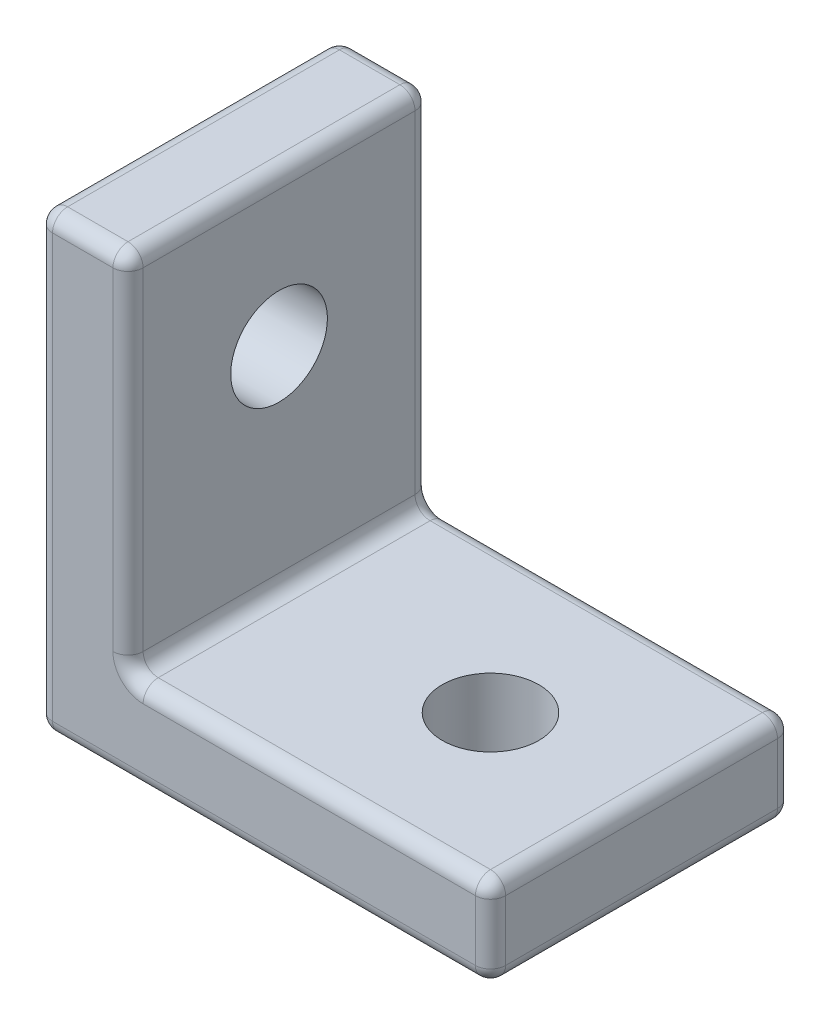
ISO-10303-21;
HEADER;
FILE_DESCRIPTION(('STEP AP214'),'2;1');
FILE_NAME('part.step','',(''),(''),'','','');
FILE_SCHEMA(('AUTOMOTIVE_DESIGN { 1 0 10303 214 1 1 1 1 }'));
ENDSEC;
DATA;
#1=APPLICATION_CONTEXT('core data for automotive mechanical design processes');
#2=APPLICATION_PROTOCOL_DEFINITION('international standard','automotive_design',2000,#1);
#3=PRODUCT_CONTEXT('',#1,'mechanical');
#4=PRODUCT('Part','Part','',(#3));
#5=PRODUCT_RELATED_PRODUCT_CATEGORY('part','',(#4));
#6=PRODUCT_DEFINITION_FORMATION('','',#4);
#7=PRODUCT_DEFINITION_CONTEXT('part definition',#1,'design');
#8=PRODUCT_DEFINITION('design','',#6,#7);
#9=PRODUCT_DEFINITION_SHAPE('','',#8);
#10=(LENGTH_UNIT() NAMED_UNIT(*) SI_UNIT(.MILLI.,.METRE.));
#11=(NAMED_UNIT(*) PLANE_ANGLE_UNIT() SI_UNIT($,.RADIAN.));
#12=(NAMED_UNIT(*) SI_UNIT($,.STERADIAN.) SOLID_ANGLE_UNIT());
#13=UNCERTAINTY_MEASURE_WITH_UNIT(LENGTH_MEASURE(1.E-05),#10,'distance_accuracy_value','');
#14=(GEOMETRIC_REPRESENTATION_CONTEXT(3) GLOBAL_UNCERTAINTY_ASSIGNED_CONTEXT((#13)) GLOBAL_UNIT_ASSIGNED_CONTEXT((#10,
#11,#12)) REPRESENTATION_CONTEXT('',''));
#15=CARTESIAN_POINT('',(0.,0.,0.));
#16=DIRECTION('',(0.,0.,1.));
#17=DIRECTION('',(1.,0.,0.));
#18=AXIS2_PLACEMENT_3D('',#15,#16,#17);
#19=CARTESIAN_POINT('',(3.,15.,10.));
#20=DIRECTION('',(0.,-1.,0.));
#21=DIRECTION('',(0.,0.,-1.));
#22=AXIS2_PLACEMENT_3D('',#19,#20,#21);
#23=PLANE('',#22);
#24=DIRECTION('',(-1.,0.,0.));
#25=VECTOR('',#24,1.);
#26=CARTESIAN_POINT('',(3.,15.,0.5));
#27=LINE('',#26,#25);
#28=CARTESIAN_POINT('',(2.5,15.,0.5));
#29=VERTEX_POINT('',#28);
#30=CARTESIAN_POINT('',(0.499999999999998,15.,0.5));
#31=VERTEX_POINT('',#30);
#32=EDGE_CURVE('E227',#29,#31,#27,.T.);
#33=ORIENTED_EDGE('',*,*,#32,.T.);
#34=DIRECTION('',(0.,0.,-1.));
#35=VECTOR('',#34,1.);
#36=CARTESIAN_POINT('',(0.499999999999998,15.,10.));
#37=LINE('',#36,#35);
#38=CARTESIAN_POINT('',(0.499999999999998,15.,9.5));
#39=VERTEX_POINT('',#38);
#40=EDGE_CURVE('E224',#31,#39,#37,.F.);
#41=ORIENTED_EDGE('',*,*,#40,.T.);
#42=DIRECTION('',(-1.,0.,0.));
#43=VECTOR('',#42,1.);
#44=CARTESIAN_POINT('',(3.,15.,9.5));
#45=LINE('',#44,#43);
#46=CARTESIAN_POINT('',(2.5,15.,9.5));
#47=VERTEX_POINT('',#46);
#48=EDGE_CURVE('E217',#39,#47,#45,.F.);
#49=ORIENTED_EDGE('',*,*,#48,.T.);
#50=DIRECTION('',(0.,0.,-1.));
#51=VECTOR('',#50,1.);
#52=CARTESIAN_POINT('',(2.5,15.,10.));
#53=LINE('',#52,#51);
#54=EDGE_CURVE('E221',#47,#29,#53,.T.);
#55=ORIENTED_EDGE('',*,*,#54,.T.);
#56=EDGE_LOOP('',(#33,#41,#49,#55));
#57=FACE_BOUND('',#56,.T.);
#58=ADVANCED_FACE('F45',(#57),#23,.F.);
#59=CARTESIAN_POINT('',(0.,15.,10.));
#60=DIRECTION('',(1.,0.,0.));
#61=DIRECTION('',(0.,1.,0.));
#62=AXIS2_PLACEMENT_3D('',#59,#60,#61);
#63=PLANE('',#62);
#64=DIRECTION('',(0.,-1.,0.));
#65=VECTOR('',#64,1.);
#66=CARTESIAN_POINT('',(0.,15.,0.5));
#67=LINE('',#66,#65);
#68=CARTESIAN_POINT('',(0.,14.5,0.5));
#69=VERTEX_POINT('',#68);
#70=CARTESIAN_POINT('',(0.,0.5,0.5));
#71=VERTEX_POINT('',#70);
#72=EDGE_CURVE('E296',#69,#71,#67,.T.);
#73=ORIENTED_EDGE('',*,*,#72,.T.);
#74=DIRECTION('',(0.,0.,-1.));
#75=VECTOR('',#74,1.);
#76=CARTESIAN_POINT('',(0.,0.5,10.));
#77=LINE('',#76,#75);
#78=CARTESIAN_POINT('',(0.,0.5,9.5));
#79=VERTEX_POINT('',#78);
#80=EDGE_CURVE('E300',#71,#79,#77,.F.);
#81=ORIENTED_EDGE('',*,*,#80,.T.);
#82=DIRECTION('',(0.,-1.,0.));
#83=VECTOR('',#82,1.);
#84=CARTESIAN_POINT('',(0.,15.,9.5));
#85=LINE('',#84,#83);
#86=CARTESIAN_POINT('',(0.,14.5,9.5));
#87=VERTEX_POINT('',#86);
#88=EDGE_CURVE('E293',#79,#87,#85,.F.);
#89=ORIENTED_EDGE('',*,*,#88,.T.);
#90=DIRECTION('',(0.,0.,-1.));
#91=VECTOR('',#90,1.);
#92=CARTESIAN_POINT('',(0.,14.5,10.));
#93=LINE('',#92,#91);
#94=EDGE_CURVE('E290',#87,#69,#93,.T.);
#95=ORIENTED_EDGE('',*,*,#94,.T.);
#96=EDGE_LOOP('',(#73,#81,#89,#95));
#97=FACE_BOUND('',#96,.T.);
#98=CARTESIAN_POINT('',(0.,10.,5.));
#99=DIRECTION('',(-1.,0.,0.));
#100=DIRECTION('',(0.,-1.,0.));
#101=AXIS2_PLACEMENT_3D('',#98,#99,#100);
#102=CIRCLE('',#101,1.6);
#103=CARTESIAN_POINT('',(0.,8.4,5.));
#104=VERTEX_POINT('',#103);
#105=EDGE_CURVE('E493',#104,#104,#102,.T.);
#106=ORIENTED_EDGE('',*,*,#105,.F.);
#107=EDGE_LOOP('',(#106));
#108=FACE_BOUND('',#107,.T.);
#109=ADVANCED_FACE('F516',(#97,#108),#63,.F.);
#110=CARTESIAN_POINT('',(0.,0.,10.));
#111=DIRECTION('',(0.,1.,0.));
#112=DIRECTION('',(0.,0.,1.));
#113=AXIS2_PLACEMENT_3D('',#110,#111,#112);
#114=PLANE('',#113);
#115=DIRECTION('',(1.,0.,0.));
#116=VECTOR('',#115,1.);
#117=CARTESIAN_POINT('',(0.,0.,0.5));
#118=LINE('',#117,#116);
#119=CARTESIAN_POINT('',(0.5,0.,0.5));
#120=VERTEX_POINT('',#119);
#121=CARTESIAN_POINT('',(14.5,0.,0.5));
#122=VERTEX_POINT('',#121);
#123=EDGE_CURVE('E309',#120,#122,#118,.T.);
#124=ORIENTED_EDGE('',*,*,#123,.T.);
#125=DIRECTION('',(0.,0.,-1.));
#126=VECTOR('',#125,1.);
#127=CARTESIAN_POINT('',(14.5,0.,10.));
#128=LINE('',#127,#126);
#129=CARTESIAN_POINT('',(14.5,0.,9.5));
#130=VERTEX_POINT('',#129);
#131=EDGE_CURVE('E313',#122,#130,#128,.F.);
#132=ORIENTED_EDGE('',*,*,#131,.T.);
#133=DIRECTION('',(1.,0.,0.));
#134=VECTOR('',#133,1.);
#135=CARTESIAN_POINT('',(0.,0.,9.5));
#136=LINE('',#135,#134);
#137=CARTESIAN_POINT('',(0.5,0.,9.5));
#138=VERTEX_POINT('',#137);
#139=EDGE_CURVE('E306',#130,#138,#136,.F.);
#140=ORIENTED_EDGE('',*,*,#139,.T.);
#141=DIRECTION('',(0.,0.,-1.));
#142=VECTOR('',#141,1.);
#143=CARTESIAN_POINT('',(0.5,0.,10.));
#144=LINE('',#143,#142);
#145=EDGE_CURVE('E303',#138,#120,#144,.T.);
#146=ORIENTED_EDGE('',*,*,#145,.T.);
#147=EDGE_LOOP('',(#124,#132,#140,#146));
#148=FACE_BOUND('',#147,.T.);
#149=CARTESIAN_POINT('',(10.,0.,5.));
#150=DIRECTION('',(0.,-1.,0.));
#151=DIRECTION('',(0.,0.,-1.));
#152=AXIS2_PLACEMENT_3D('',#149,#150,#151);
#153=CIRCLE('',#152,1.6);
#154=CARTESIAN_POINT('',(10.,0.,3.4));
#155=VERTEX_POINT('',#154);
#156=EDGE_CURVE('E258',#155,#155,#153,.T.);
#157=ORIENTED_EDGE('',*,*,#156,.F.);
#158=EDGE_LOOP('',(#157));
#159=FACE_BOUND('',#158,.T.);
#160=ADVANCED_FACE('F513',(#148,#159),#114,.F.);
#161=CARTESIAN_POINT('',(15.,0.,10.));
#162=DIRECTION('',(-1.,0.,0.));
#163=DIRECTION('',(0.,0.,1.));
#164=AXIS2_PLACEMENT_3D('',#161,#162,#163);
#165=PLANE('',#164);
#166=DIRECTION('',(0.,1.,0.));
#167=VECTOR('',#166,1.);
#168=CARTESIAN_POINT('',(15.,0.,0.5));
#169=LINE('',#168,#167);
#170=CARTESIAN_POINT('',(15.,0.5,0.5));
#171=VERTEX_POINT('',#170);
#172=CARTESIAN_POINT('',(15.,2.5,0.5));
#173=VERTEX_POINT('',#172);
#174=EDGE_CURVE('E322',#171,#173,#169,.T.);
#175=ORIENTED_EDGE('',*,*,#174,.T.);
#176=DIRECTION('',(0.,0.,-1.));
#177=VECTOR('',#176,1.);
#178=CARTESIAN_POINT('',(15.,2.5,10.));
#179=LINE('',#178,#177);
#180=CARTESIAN_POINT('',(15.,2.5,9.5));
#181=VERTEX_POINT('',#180);
#182=EDGE_CURVE('E326',#173,#181,#179,.F.);
#183=ORIENTED_EDGE('',*,*,#182,.T.);
#184=DIRECTION('',(0.,1.,0.));
#185=VECTOR('',#184,1.);
#186=CARTESIAN_POINT('',(15.,0.,9.5));
#187=LINE('',#186,#185);
#188=CARTESIAN_POINT('',(15.,0.5,9.5));
#189=VERTEX_POINT('',#188);
#190=EDGE_CURVE('E319',#181,#189,#187,.F.);
#191=ORIENTED_EDGE('',*,*,#190,.T.);
#192=DIRECTION('',(0.,0.,-1.));
#193=VECTOR('',#192,1.);
#194=CARTESIAN_POINT('',(15.,0.5,10.));
#195=LINE('',#194,#193);
#196=EDGE_CURVE('E316',#189,#171,#195,.T.);
#197=ORIENTED_EDGE('',*,*,#196,.T.);
#198=EDGE_LOOP('',(#175,#183,#191,#197));
#199=FACE_BOUND('',#198,.T.);
#200=ADVANCED_FACE('F515',(#199),#165,.F.);
#201=CARTESIAN_POINT('',(15.,3.,10.));
#202=DIRECTION('',(0.,-1.,0.));
#203=DIRECTION('',(1.,0.,0.));
#204=AXIS2_PLACEMENT_3D('',#201,#202,#203);
#205=PLANE('',#204);
#206=DIRECTION('',(-1.,0.,0.));
#207=VECTOR('',#206,1.);
#208=CARTESIAN_POINT('',(15.,3.,9.5));
#209=LINE('',#208,#207);
#210=CARTESIAN_POINT('',(3.5,3.,9.5));
#211=VERTEX_POINT('',#210);
#212=CARTESIAN_POINT('',(14.5,3.,9.5));
#213=VERTEX_POINT('',#212);
#214=EDGE_CURVE('E332',#211,#213,#209,.F.);
#215=ORIENTED_EDGE('',*,*,#214,.T.);
#216=DIRECTION('',(0.,0.,-1.));
#217=VECTOR('',#216,1.);
#218=CARTESIAN_POINT('',(14.5,3.,10.));
#219=LINE('',#218,#217);
#220=CARTESIAN_POINT('',(14.5,3.,0.5));
#221=VERTEX_POINT('',#220);
#222=EDGE_CURVE('E339',#213,#221,#219,.T.);
#223=ORIENTED_EDGE('',*,*,#222,.T.);
#224=DIRECTION('',(-1.,0.,0.));
#225=VECTOR('',#224,1.);
#226=CARTESIAN_POINT('',(15.,3.,0.5));
#227=LINE('',#226,#225);
#228=CARTESIAN_POINT('',(3.5,3.,0.5));
#229=VERTEX_POINT('',#228);
#230=EDGE_CURVE('E335',#221,#229,#227,.T.);
#231=ORIENTED_EDGE('',*,*,#230,.T.);
#232=DIRECTION('',(0.,0.,-1.));
#233=VECTOR('',#232,1.);
#234=CARTESIAN_POINT('',(3.5,3.,10.));
#235=LINE('',#234,#233);
#236=EDGE_CURVE('E329',#229,#211,#235,.F.);
#237=ORIENTED_EDGE('',*,*,#236,.T.);
#238=EDGE_LOOP('',(#215,#223,#231,#237));
#239=FACE_BOUND('',#238,.T.);
#240=CARTESIAN_POINT('',(10.,3.,5.));
#241=DIRECTION('',(0.,-1.,0.));
#242=DIRECTION('',(1.,0.,0.));
#243=AXIS2_PLACEMENT_3D('',#240,#241,#242);
#244=CIRCLE('',#243,1.6);
#245=CARTESIAN_POINT('',(11.6,3.,5.));
#246=VERTEX_POINT('',#245);
#247=EDGE_CURVE('E254',#246,#246,#244,.T.);
#248=ORIENTED_EDGE('',*,*,#247,.T.);
#249=EDGE_LOOP('',(#248));
#250=FACE_BOUND('',#249,.T.);
#251=ADVANCED_FACE('F523',(#239,#250),#205,.F.);
#252=CARTESIAN_POINT('',(3.,3.,10.));
#253=DIRECTION('',(-1.,0.,0.));
#254=DIRECTION('',(0.,-1.,0.));
#255=AXIS2_PLACEMENT_3D('',#252,#253,#254);
#256=PLANE('',#255);
#257=DIRECTION('',(0.,1.,0.));
#258=VECTOR('',#257,1.);
#259=CARTESIAN_POINT('',(3.,3.,0.5));
#260=LINE('',#259,#258);
#261=CARTESIAN_POINT('',(3.,3.5,0.5));
#262=VERTEX_POINT('',#261);
#263=CARTESIAN_POINT('',(3.,14.5,0.5));
#264=VERTEX_POINT('',#263);
#265=EDGE_CURVE('E348',#262,#264,#260,.T.);
#266=ORIENTED_EDGE('',*,*,#265,.T.);
#267=DIRECTION('',(0.,0.,-1.));
#268=VECTOR('',#267,1.);
#269=CARTESIAN_POINT('',(3.,14.5,10.));
#270=LINE('',#269,#268);
#271=CARTESIAN_POINT('',(3.,14.5,9.5));
#272=VERTEX_POINT('',#271);
#273=EDGE_CURVE('E352',#264,#272,#270,.F.);
#274=ORIENTED_EDGE('',*,*,#273,.T.);
#275=DIRECTION('',(0.,1.,0.));
#276=VECTOR('',#275,1.);
#277=CARTESIAN_POINT('',(3.,3.,9.5));
#278=LINE('',#277,#276);
#279=CARTESIAN_POINT('',(3.,3.5,9.5));
#280=VERTEX_POINT('',#279);
#281=EDGE_CURVE('E345',#272,#280,#278,.F.);
#282=ORIENTED_EDGE('',*,*,#281,.T.);
#283=DIRECTION('',(0.,0.,-1.));
#284=VECTOR('',#283,1.);
#285=CARTESIAN_POINT('',(3.,3.5,0.));
#286=LINE('',#285,#284);
#287=EDGE_CURVE('E342',#280,#262,#286,.T.);
#288=ORIENTED_EDGE('',*,*,#287,.T.);
#289=EDGE_LOOP('',(#266,#274,#282,#288));
#290=FACE_BOUND('',#289,.T.);
#291=CARTESIAN_POINT('',(3.,10.,5.));
#292=DIRECTION('',(-1.,0.,0.));
#293=DIRECTION('',(0.,-1.,0.));
#294=AXIS2_PLACEMENT_3D('',#291,#292,#293);
#295=CIRCLE('',#294,1.6);
#296=CARTESIAN_POINT('',(3.,8.4,5.));
#297=VERTEX_POINT('',#296);
#298=EDGE_CURVE('E261',#297,#297,#295,.T.);
#299=ORIENTED_EDGE('',*,*,#298,.T.);
#300=EDGE_LOOP('',(#299));
#301=FACE_BOUND('',#300,.T.);
#302=ADVANCED_FACE('F665',(#290,#301),#256,.F.);
#303=CARTESIAN_POINT('',(0.,0.,10.));
#304=DIRECTION('',(0.,0.,1.));
#305=DIRECTION('',(1.,0.,0.));
#306=AXIS2_PLACEMENT_3D('',#303,#304,#305);
#307=PLANE('',#306);
#308=DIRECTION('',(0.,1.,0.));
#309=VECTOR('',#308,1.);
#310=CARTESIAN_POINT('',(2.5,15.,10.));
#311=LINE('',#310,#309);
#312=CARTESIAN_POINT('',(2.5,3.5,10.));
#313=VERTEX_POINT('',#312);
#314=CARTESIAN_POINT('',(2.5,14.5,10.));
#315=VERTEX_POINT('',#314);
#316=EDGE_CURVE('E355',#313,#315,#311,.T.);
#317=ORIENTED_EDGE('',*,*,#316,.T.);
#318=DIRECTION('',(-1.,0.,0.));
#319=VECTOR('',#318,1.);
#320=CARTESIAN_POINT('',(0.,14.5,10.));
#321=LINE('',#320,#319);
#322=CARTESIAN_POINT('',(0.499999999999998,14.5,10.));
#323=VERTEX_POINT('',#322);
#324=EDGE_CURVE('E11',#315,#323,#321,.T.);
#325=ORIENTED_EDGE('',*,*,#324,.T.);
#326=DIRECTION('',(0.,-1.,0.));
#327=VECTOR('',#326,1.);
#328=CARTESIAN_POINT('',(0.5,0.,10.));
#329=LINE('',#328,#327);
#330=CARTESIAN_POINT('',(0.5,0.5,10.));
#331=VERTEX_POINT('',#330);
#332=EDGE_CURVE('E55',#323,#331,#329,.T.);
#333=ORIENTED_EDGE('',*,*,#332,.T.);
#334=DIRECTION('',(1.,0.,0.));
#335=VECTOR('',#334,1.);
#336=CARTESIAN_POINT('',(15.,0.5,10.));
#337=LINE('',#336,#335);
#338=CARTESIAN_POINT('',(14.5,0.5,10.));
#339=VERTEX_POINT('',#338);
#340=EDGE_CURVE('E368',#331,#339,#337,.T.);
#341=ORIENTED_EDGE('',*,*,#340,.T.);
#342=DIRECTION('',(0.,1.,0.));
#343=VECTOR('',#342,1.);
#344=CARTESIAN_POINT('',(14.5,3.,10.));
#345=LINE('',#344,#343);
#346=CARTESIAN_POINT('',(14.5,2.5,10.));
#347=VERTEX_POINT('',#346);
#348=EDGE_CURVE('E365',#339,#347,#345,.T.);
#349=ORIENTED_EDGE('',*,*,#348,.T.);
#350=DIRECTION('',(-1.,0.,0.));
#351=VECTOR('',#350,1.);
#352=CARTESIAN_POINT('',(3.,2.5,10.));
#353=LINE('',#352,#351);
#354=CARTESIAN_POINT('',(3.5,2.5,10.));
#355=VERTEX_POINT('',#354);
#356=EDGE_CURVE('E362',#347,#355,#353,.T.);
#357=ORIENTED_EDGE('',*,*,#356,.T.);
#358=CARTESIAN_POINT('',(3.5,3.5,10.));
#359=DIRECTION('',(0.,0.,1.));
#360=DIRECTION('',(1.,0.,0.));
#361=AXIS2_PLACEMENT_3D('',#358,#359,#360);
#362=CIRCLE('',#361,1.);
#363=EDGE_CURVE('E358',#313,#355,#362,.T.);
#364=ORIENTED_EDGE('',*,*,#363,.F.);
#365=EDGE_LOOP('',(#317,#325,#333,#341,#349,#357,#364));
#366=FACE_BOUND('',#365,.T.);
#367=ADVANCED_FACE('F647',(#366),#307,.T.);
#368=CARTESIAN_POINT('',(0.,0.,0.));
#369=DIRECTION('',(0.,0.,1.));
#370=DIRECTION('',(1.,0.,0.));
#371=AXIS2_PLACEMENT_3D('',#368,#369,#370);
#372=PLANE('',#371);
#373=DIRECTION('',(0.,-1.,0.));
#374=VECTOR('',#373,1.);
#375=CARTESIAN_POINT('',(0.5,0.,0.));
#376=LINE('',#375,#374);
#377=CARTESIAN_POINT('',(0.5,0.5,0.));
#378=VERTEX_POINT('',#377);
#379=CARTESIAN_POINT('',(0.499999999999998,14.5,0.));
#380=VERTEX_POINT('',#379);
#381=EDGE_CURVE('E283',#378,#380,#376,.F.);
#382=ORIENTED_EDGE('',*,*,#381,.T.);
#383=DIRECTION('',(-1.,0.,0.));
#384=VECTOR('',#383,1.);
#385=CARTESIAN_POINT('',(0.,14.5,0.));
#386=LINE('',#385,#384);
#387=CARTESIAN_POINT('',(2.5,14.5,0.));
#388=VERTEX_POINT('',#387);
#389=EDGE_CURVE('E286',#380,#388,#386,.F.);
#390=ORIENTED_EDGE('',*,*,#389,.T.);
#391=DIRECTION('',(0.,1.,0.));
#392=VECTOR('',#391,1.);
#393=CARTESIAN_POINT('',(2.5,0.,0.));
#394=LINE('',#393,#392);
#395=CARTESIAN_POINT('',(2.5,3.5,0.));
#396=VERTEX_POINT('',#395);
#397=EDGE_CURVE('E271',#388,#396,#394,.F.);
#398=ORIENTED_EDGE('',*,*,#397,.T.);
#399=CARTESIAN_POINT('',(3.5,3.5,0.));
#400=DIRECTION('',(0.,0.,1.));
#401=DIRECTION('',(1.,0.,0.));
#402=AXIS2_PLACEMENT_3D('',#399,#400,#401);
#403=CIRCLE('',#402,1.);
#404=CARTESIAN_POINT('',(3.5,2.5,0.));
#405=VERTEX_POINT('',#404);
#406=EDGE_CURVE('E267',#405,#396,#403,.F.);
#407=ORIENTED_EDGE('',*,*,#406,.F.);
#408=DIRECTION('',(-1.,0.,0.));
#409=VECTOR('',#408,1.);
#410=CARTESIAN_POINT('',(0.,2.5,0.));
#411=LINE('',#410,#409);
#412=CARTESIAN_POINT('',(14.5,2.5,0.));
#413=VERTEX_POINT('',#412);
#414=EDGE_CURVE('E274',#405,#413,#411,.F.);
#415=ORIENTED_EDGE('',*,*,#414,.T.);
#416=DIRECTION('',(0.,1.,0.));
#417=VECTOR('',#416,1.);
#418=CARTESIAN_POINT('',(14.5,0.,0.));
#419=LINE('',#418,#417);
#420=CARTESIAN_POINT('',(14.5,0.5,0.));
#421=VERTEX_POINT('',#420);
#422=EDGE_CURVE('E277',#413,#421,#419,.F.);
#423=ORIENTED_EDGE('',*,*,#422,.T.);
#424=DIRECTION('',(1.,0.,0.));
#425=VECTOR('',#424,1.);
#426=CARTESIAN_POINT('',(0.,0.5,0.));
#427=LINE('',#426,#425);
#428=EDGE_CURVE('E280',#421,#378,#427,.F.);
#429=ORIENTED_EDGE('',*,*,#428,.T.);
#430=EDGE_LOOP('',(#382,#390,#398,#407,#415,#423,#429));
#431=FACE_BOUND('',#430,.T.);
#432=ADVANCED_FACE('F694',(#431),#372,.F.);
#433=CARTESIAN_POINT('',(10.,5.,5.));
#434=DIRECTION('',(0.,-1.,0.));
#435=DIRECTION('',(0.,0.,-1.));
#436=AXIS2_PLACEMENT_3D('',#433,#434,#435);
#437=CYLINDRICAL_SURFACE('',#436,1.6);
#438=ORIENTED_EDGE('',*,*,#156,.T.);
#439=EDGE_LOOP('',(#438));
#440=FACE_BOUND('',#439,.T.);
#441=ORIENTED_EDGE('',*,*,#247,.F.);
#442=EDGE_LOOP('',(#441));
#443=FACE_BOUND('',#442,.T.);
#444=ADVANCED_FACE('F510',(#440,#443),#437,.F.);
#445=CARTESIAN_POINT('',(5.,10.,5.));
#446=DIRECTION('',(-1.,0.,0.));
#447=DIRECTION('',(0.,-1.,0.));
#448=AXIS2_PLACEMENT_3D('',#445,#446,#447);
#449=CYLINDRICAL_SURFACE('',#448,1.6);
#450=ORIENTED_EDGE('',*,*,#105,.T.);
#451=EDGE_LOOP('',(#450));
#452=FACE_BOUND('',#451,.T.);
#453=ORIENTED_EDGE('',*,*,#298,.F.);
#454=EDGE_LOOP('',(#453));
#455=FACE_BOUND('',#454,.T.);
#456=ADVANCED_FACE('F641',(#452,#455),#449,.F.);
#457=CARTESIAN_POINT('',(14.5,0.,9.5));
#458=DIRECTION('',(0.,-1.,0.));
#459=DIRECTION('',(0.,0.,-1.));
#460=AXIS2_PLACEMENT_3D('',#457,#458,#459);
#461=CYLINDRICAL_SURFACE('',#460,0.5);
#462=CARTESIAN_POINT('',(14.5,2.5,9.5));
#463=DIRECTION('',(0.,1.,0.));
#464=DIRECTION('',(0.,0.,1.));
#465=AXIS2_PLACEMENT_3D('',#462,#463,#464);
#466=CIRCLE('',#465,0.5);
#467=EDGE_CURVE('E49',#347,#181,#466,.T.);
#468=ORIENTED_EDGE('',*,*,#467,.F.);
#469=ORIENTED_EDGE('',*,*,#348,.F.);
#470=CARTESIAN_POINT('',(14.5,0.5,9.5));
#471=DIRECTION('',(0.,-1.,0.));
#472=DIRECTION('',(0.,0.,-1.));
#473=AXIS2_PLACEMENT_3D('',#470,#471,#472);
#474=CIRCLE('',#473,0.5);
#475=EDGE_CURVE('E484',#189,#339,#474,.T.);
#476=ORIENTED_EDGE('',*,*,#475,.F.);
#477=ORIENTED_EDGE('',*,*,#190,.F.);
#478=EDGE_LOOP('',(#468,#469,#476,#477));
#479=FACE_BOUND('',#478,.T.);
#480=ADVANCED_FACE('F47',(#479),#461,.T.);
#481=CARTESIAN_POINT('',(14.5,2.5,9.5));
#482=DIRECTION('',(1.,0.,0.));
#483=DIRECTION('',(0.,0.,-1.));
#484=AXIS2_PLACEMENT_3D('',#481,#482,#483);
#485=SPHERICAL_SURFACE('',#484,0.5);
#486=CARTESIAN_POINT('',(14.5,2.5,9.5));
#487=DIRECTION('',(1.,0.,0.));
#488=DIRECTION('',(0.,0.,-1.));
#489=AXIS2_PLACEMENT_3D('',#486,#487,#488);
#490=CIRCLE('',#489,0.5);
#491=EDGE_CURVE('E477',#347,#213,#490,.F.);
#492=ORIENTED_EDGE('',*,*,#491,.F.);
#493=ORIENTED_EDGE('',*,*,#467,.T.);
#494=CARTESIAN_POINT('',(14.5,2.5,9.5));
#495=DIRECTION('',(0.,0.,1.));
#496=DIRECTION('',(1.,0.,0.));
#497=AXIS2_PLACEMENT_3D('',#494,#495,#496);
#498=CIRCLE('',#497,0.5);
#499=EDGE_CURVE('E481',#213,#181,#498,.F.);
#500=ORIENTED_EDGE('',*,*,#499,.F.);
#501=EDGE_LOOP('',(#492,#493,#500));
#502=FACE_BOUND('',#501,.T.);
#503=ADVANCED_FACE('F636',(#502),#485,.T.);
#504=CARTESIAN_POINT('',(14.5,0.5,9.5));
#505=DIRECTION('',(0.,0.,1.));
#506=DIRECTION('',(1.,0.,0.));
#507=AXIS2_PLACEMENT_3D('',#504,#505,#506);
#508=SPHERICAL_SURFACE('',#507,0.5);
#509=CARTESIAN_POINT('',(14.5,0.5,9.5));
#510=DIRECTION('',(0.,0.,1.));
#511=DIRECTION('',(1.,0.,0.));
#512=AXIS2_PLACEMENT_3D('',#509,#510,#511);
#513=CIRCLE('',#512,0.5);
#514=EDGE_CURVE('E469',#189,#130,#513,.F.);
#515=ORIENTED_EDGE('',*,*,#514,.F.);
#516=ORIENTED_EDGE('',*,*,#475,.T.);
#517=CARTESIAN_POINT('',(14.5,0.5,9.5));
#518=DIRECTION('',(1.,0.,0.));
#519=DIRECTION('',(0.,0.,-1.));
#520=AXIS2_PLACEMENT_3D('',#517,#518,#519);
#521=CIRCLE('',#520,0.5);
#522=EDGE_CURVE('E473',#130,#339,#521,.F.);
#523=ORIENTED_EDGE('',*,*,#522,.F.);
#524=EDGE_LOOP('',(#515,#516,#523));
#525=FACE_BOUND('',#524,.T.);
#526=ADVANCED_FACE('F633',(#525),#508,.T.);
#527=CARTESIAN_POINT('',(14.5,2.5,10.));
#528=DIRECTION('',(0.,0.,-1.));
#529=DIRECTION('',(-1.,0.,0.));
#530=AXIS2_PLACEMENT_3D('',#527,#528,#529);
#531=CYLINDRICAL_SURFACE('',#530,0.5);
#532=ORIENTED_EDGE('',*,*,#499,.T.);
#533=ORIENTED_EDGE('',*,*,#182,.F.);
#534=CARTESIAN_POINT('',(14.5,2.5,0.5));
#535=DIRECTION('',(0.,0.,-1.));
#536=DIRECTION('',(-1.,0.,0.));
#537=AXIS2_PLACEMENT_3D('',#534,#535,#536);
#538=CIRCLE('',#537,0.5);
#539=EDGE_CURVE('E462',#221,#173,#538,.T.);
#540=ORIENTED_EDGE('',*,*,#539,.F.);
#541=ORIENTED_EDGE('',*,*,#222,.F.);
#542=EDGE_LOOP('',(#532,#533,#540,#541));
#543=FACE_BOUND('',#542,.T.);
#544=ADVANCED_FACE('F629',(#543),#531,.T.);
#545=CARTESIAN_POINT('',(0.,2.5,9.5));
#546=DIRECTION('',(1.,0.,0.));
#547=DIRECTION('',(0.,1.,0.));
#548=AXIS2_PLACEMENT_3D('',#545,#546,#547);
#549=CYLINDRICAL_SURFACE('',#548,0.5);
#550=ORIENTED_EDGE('',*,*,#491,.T.);
#551=ORIENTED_EDGE('',*,*,#214,.F.);
#552=CARTESIAN_POINT('',(3.5,2.5,9.5));
#553=DIRECTION('',(-1.,0.,0.));
#554=DIRECTION('',(0.,0.,1.));
#555=AXIS2_PLACEMENT_3D('',#552,#553,#554);
#556=CIRCLE('',#555,0.5);
#557=EDGE_CURVE('E458',#355,#211,#556,.T.);
#558=ORIENTED_EDGE('',*,*,#557,.F.);
#559=ORIENTED_EDGE('',*,*,#356,.F.);
#560=EDGE_LOOP('',(#550,#551,#558,#559));
#561=FACE_BOUND('',#560,.T.);
#562=ADVANCED_FACE('F625',(#561),#549,.T.);
#563=CARTESIAN_POINT('',(0.,0.5,9.5));
#564=DIRECTION('',(-1.,0.,0.));
#565=DIRECTION('',(0.,0.,1.));
#566=AXIS2_PLACEMENT_3D('',#563,#564,#565);
#567=CYLINDRICAL_SURFACE('',#566,0.5);
#568=ORIENTED_EDGE('',*,*,#522,.T.);
#569=ORIENTED_EDGE('',*,*,#340,.F.);
#570=CARTESIAN_POINT('',(0.5,0.5,9.5));
#571=DIRECTION('',(-1.,0.,0.));
#572=DIRECTION('',(0.,0.,1.));
#573=AXIS2_PLACEMENT_3D('',#570,#571,#572);
#574=CIRCLE('',#573,0.5);
#575=EDGE_CURVE('E454',#138,#331,#574,.T.);
#576=ORIENTED_EDGE('',*,*,#575,.F.);
#577=ORIENTED_EDGE('',*,*,#139,.F.);
#578=EDGE_LOOP('',(#568,#569,#576,#577));
#579=FACE_BOUND('',#578,.T.);
#580=ADVANCED_FACE('F621',(#579),#567,.T.);
#581=CARTESIAN_POINT('',(14.5,0.5,10.));
#582=DIRECTION('',(0.,0.,-1.));
#583=DIRECTION('',(-1.,0.,0.));
#584=AXIS2_PLACEMENT_3D('',#581,#582,#583);
#585=CYLINDRICAL_SURFACE('',#584,0.5);
#586=ORIENTED_EDGE('',*,*,#514,.T.);
#587=ORIENTED_EDGE('',*,*,#131,.F.);
#588=CARTESIAN_POINT('',(14.5,0.5,0.5));
#589=DIRECTION('',(0.,0.,-1.));
#590=DIRECTION('',(-1.,0.,0.));
#591=AXIS2_PLACEMENT_3D('',#588,#589,#590);
#592=CIRCLE('',#591,0.5);
#593=EDGE_CURVE('E450',#171,#122,#592,.T.);
#594=ORIENTED_EDGE('',*,*,#593,.F.);
#595=ORIENTED_EDGE('',*,*,#196,.F.);
#596=EDGE_LOOP('',(#586,#587,#594,#595));
#597=FACE_BOUND('',#596,.T.);
#598=ADVANCED_FACE('F617',(#597),#585,.T.);
#599=CARTESIAN_POINT('',(14.5,0.,0.5));
#600=DIRECTION('',(0.,1.,0.));
#601=DIRECTION('',(0.,0.,1.));
#602=AXIS2_PLACEMENT_3D('',#599,#600,#601);
#603=CYLINDRICAL_SURFACE('',#602,0.5);
#604=CARTESIAN_POINT('',(14.5,2.5,0.5));
#605=DIRECTION('',(0.,1.,0.));
#606=DIRECTION('',(0.,0.,1.));
#607=AXIS2_PLACEMENT_3D('',#604,#605,#606);
#608=CIRCLE('',#607,0.5);
#609=EDGE_CURVE('E465',#173,#413,#608,.T.);
#610=ORIENTED_EDGE('',*,*,#609,.F.);
#611=ORIENTED_EDGE('',*,*,#174,.F.);
#612=CARTESIAN_POINT('',(14.5,0.5,0.5));
#613=DIRECTION('',(0.,-1.,0.));
#614=DIRECTION('',(0.,0.,-1.));
#615=AXIS2_PLACEMENT_3D('',#612,#613,#614);
#616=CIRCLE('',#615,0.5);
#617=EDGE_CURVE('E446',#421,#171,#616,.T.);
#618=ORIENTED_EDGE('',*,*,#617,.F.);
#619=ORIENTED_EDGE('',*,*,#422,.F.);
#620=EDGE_LOOP('',(#610,#611,#618,#619));
#621=FACE_BOUND('',#620,.T.);
#622=ADVANCED_FACE('F613',(#621),#603,.T.);
#623=CARTESIAN_POINT('',(14.5,2.5,0.5));
#624=DIRECTION('',(1.,0.,0.));
#625=DIRECTION('',(0.,0.,-1.));
#626=AXIS2_PLACEMENT_3D('',#623,#624,#625);
#627=SPHERICAL_SURFACE('',#626,0.5);
#628=ORIENTED_EDGE('',*,*,#539,.T.);
#629=ORIENTED_EDGE('',*,*,#609,.T.);
#630=CARTESIAN_POINT('',(14.5,2.5,0.5));
#631=DIRECTION('',(1.,0.,0.));
#632=DIRECTION('',(0.,0.,-1.));
#633=AXIS2_PLACEMENT_3D('',#630,#631,#632);
#634=CIRCLE('',#633,0.5);
#635=EDGE_CURVE('E442',#221,#413,#634,.F.);
#636=ORIENTED_EDGE('',*,*,#635,.F.);
#637=EDGE_LOOP('',(#628,#629,#636));
#638=FACE_BOUND('',#637,.T.);
#639=ADVANCED_FACE('F609',(#638),#627,.T.);
#640=CARTESIAN_POINT('',(3.5,3.5,9.5));
#641=DIRECTION('',(0.,0.,1.));
#642=DIRECTION('',(1.,0.,0.));
#643=AXIS2_PLACEMENT_3D('',#640,#641,#642);
#644=TOROIDAL_SURFACE('',#643,1.,0.5);
#645=ORIENTED_EDGE('',*,*,#363,.T.);
#646=ORIENTED_EDGE('',*,*,#557,.T.);
#647=CARTESIAN_POINT('',(3.5,3.5,9.5));
#648=DIRECTION('',(0.,0.,1.));
#649=DIRECTION('',(1.,0.,0.));
#650=AXIS2_PLACEMENT_3D('',#647,#648,#649);
#651=CIRCLE('',#650,0.5);
#652=EDGE_CURVE('E438',#280,#211,#651,.T.);
#653=ORIENTED_EDGE('',*,*,#652,.F.);
#654=CARTESIAN_POINT('',(2.5,3.5,9.5));
#655=DIRECTION('',(0.,-1.,0.));
#656=DIRECTION('',(0.,0.,-1.));
#657=AXIS2_PLACEMENT_3D('',#654,#655,#656);
#658=CIRCLE('',#657,0.5);
#659=EDGE_CURVE('E434',#313,#280,#658,.F.);
#660=ORIENTED_EDGE('',*,*,#659,.F.);
#661=EDGE_LOOP('',(#645,#646,#653,#660));
#662=FACE_BOUND('',#661,.T.);
#663=ADVANCED_FACE('F605',(#662),#644,.T.);
#664=CARTESIAN_POINT('',(0.5,0.5,9.5));
#665=DIRECTION('',(0.,0.,1.));
#666=DIRECTION('',(1.,0.,0.));
#667=AXIS2_PLACEMENT_3D('',#664,#665,#666);
#668=SPHERICAL_SURFACE('',#667,0.5);
#669=CARTESIAN_POINT('',(0.5,0.5,9.5));
#670=DIRECTION('',(0.,0.,1.));
#671=DIRECTION('',(1.,0.,0.));
#672=AXIS2_PLACEMENT_3D('',#669,#670,#671);
#673=CIRCLE('',#672,0.5);
#674=EDGE_CURVE('E426',#138,#79,#673,.F.);
#675=ORIENTED_EDGE('',*,*,#674,.F.);
#676=ORIENTED_EDGE('',*,*,#575,.T.);
#677=CARTESIAN_POINT('',(0.5,0.5,9.5));
#678=DIRECTION('',(0.,-1.,0.));
#679=DIRECTION('',(1.,0.,0.));
#680=AXIS2_PLACEMENT_3D('',#677,#678,#679);
#681=CIRCLE('',#680,0.5);
#682=EDGE_CURVE('E430',#79,#331,#681,.F.);
#683=ORIENTED_EDGE('',*,*,#682,.F.);
#684=EDGE_LOOP('',(#675,#676,#683));
#685=FACE_BOUND('',#684,.T.);
#686=ADVANCED_FACE('F601',(#685),#668,.T.);
#687=CARTESIAN_POINT('',(14.5,0.5,0.5));
#688=DIRECTION('',(1.,0.,0.));
#689=DIRECTION('',(0.,0.,-1.));
#690=AXIS2_PLACEMENT_3D('',#687,#688,#689);
#691=SPHERICAL_SURFACE('',#690,0.5);
#692=ORIENTED_EDGE('',*,*,#617,.T.);
#693=ORIENTED_EDGE('',*,*,#593,.T.);
#694=CARTESIAN_POINT('',(14.5,0.5,0.5));
#695=DIRECTION('',(1.,0.,0.));
#696=DIRECTION('',(0.,0.,-1.));
#697=AXIS2_PLACEMENT_3D('',#694,#695,#696);
#698=CIRCLE('',#697,0.5);
#699=EDGE_CURVE('E423',#421,#122,#698,.F.);
#700=ORIENTED_EDGE('',*,*,#699,.F.);
#701=EDGE_LOOP('',(#692,#693,#700));
#702=FACE_BOUND('',#701,.T.);
#703=ADVANCED_FACE('F597',(#702),#691,.T.);
#704=CARTESIAN_POINT('',(15.,2.5,0.5));
#705=DIRECTION('',(-1.,0.,0.));
#706=DIRECTION('',(0.,-1.,0.));
#707=AXIS2_PLACEMENT_3D('',#704,#705,#706);
#708=CYLINDRICAL_SURFACE('',#707,0.5);
#709=ORIENTED_EDGE('',*,*,#635,.T.);
#710=ORIENTED_EDGE('',*,*,#414,.F.);
#711=CARTESIAN_POINT('',(3.5,2.5,0.5));
#712=DIRECTION('',(-1.,0.,0.));
#713=DIRECTION('',(0.,0.,1.));
#714=AXIS2_PLACEMENT_3D('',#711,#712,#713);
#715=CIRCLE('',#714,0.5);
#716=EDGE_CURVE('E419',#229,#405,#715,.T.);
#717=ORIENTED_EDGE('',*,*,#716,.F.);
#718=ORIENTED_EDGE('',*,*,#230,.F.);
#719=EDGE_LOOP('',(#709,#710,#717,#718));
#720=FACE_BOUND('',#719,.T.);
#721=ADVANCED_FACE('F593',(#720),#708,.T.);
#722=CARTESIAN_POINT('',(3.5,3.5,10.));
#723=DIRECTION('',(0.,0.,1.));
#724=DIRECTION('',(1.,0.,0.));
#725=AXIS2_PLACEMENT_3D('',#722,#723,#724);
#726=CYLINDRICAL_SURFACE('',#725,0.5);
#727=ORIENTED_EDGE('',*,*,#652,.T.);
#728=ORIENTED_EDGE('',*,*,#236,.F.);
#729=CARTESIAN_POINT('',(3.5,3.5,0.5));
#730=DIRECTION('',(0.,0.,1.));
#731=DIRECTION('',(1.,0.,0.));
#732=AXIS2_PLACEMENT_3D('',#729,#730,#731);
#733=CIRCLE('',#732,0.5);
#734=EDGE_CURVE('E416',#262,#229,#733,.T.);
#735=ORIENTED_EDGE('',*,*,#734,.F.);
#736=ORIENTED_EDGE('',*,*,#287,.F.);
#737=EDGE_LOOP('',(#727,#728,#735,#736));
#738=FACE_BOUND('',#737,.T.);
#739=ADVANCED_FACE('F589',(#738),#726,.F.);
#740=CARTESIAN_POINT('',(2.5,0.,9.5));
#741=DIRECTION('',(0.,-1.,0.));
#742=DIRECTION('',(1.,0.,0.));
#743=AXIS2_PLACEMENT_3D('',#740,#741,#742);
#744=CYLINDRICAL_SURFACE('',#743,0.5);
#745=ORIENTED_EDGE('',*,*,#659,.T.);
#746=ORIENTED_EDGE('',*,*,#281,.F.);
#747=CARTESIAN_POINT('',(2.5,14.5,9.5));
#748=DIRECTION('',(0.,1.,0.));
#749=DIRECTION('',(0.,0.,1.));
#750=AXIS2_PLACEMENT_3D('',#747,#748,#749);
#751=CIRCLE('',#750,0.5);
#752=EDGE_CURVE('E238',#315,#272,#751,.T.);
#753=ORIENTED_EDGE('',*,*,#752,.F.);
#754=ORIENTED_EDGE('',*,*,#316,.F.);
#755=EDGE_LOOP('',(#745,#746,#753,#754));
#756=FACE_BOUND('',#755,.T.);
#757=ADVANCED_FACE('F586',(#756),#744,.T.);
#758=CARTESIAN_POINT('',(0.,14.5,9.5));
#759=DIRECTION('',(1.,0.,0.));
#760=DIRECTION('',(0.,0.,-1.));
#761=AXIS2_PLACEMENT_3D('',#758,#759,#760);
#762=CYLINDRICAL_SURFACE('',#761,0.5);
#763=CARTESIAN_POINT('',(0.499999999999998,14.5,9.5));
#764=DIRECTION('',(-1.,0.,0.));
#765=DIRECTION('',(0.,0.,1.));
#766=AXIS2_PLACEMENT_3D('',#763,#764,#765);
#767=CIRCLE('',#766,0.5);
#768=EDGE_CURVE('E239',#323,#39,#767,.T.);
#769=ORIENTED_EDGE('',*,*,#768,.F.);
#770=ORIENTED_EDGE('',*,*,#324,.F.);
#771=CARTESIAN_POINT('',(2.5,14.5,9.5));
#772=DIRECTION('',(1.,0.,0.));
#773=DIRECTION('',(0.,0.,-1.));
#774=AXIS2_PLACEMENT_3D('',#771,#772,#773);
#775=CIRCLE('',#774,0.5);
#776=EDGE_CURVE('E231',#47,#315,#775,.T.);
#777=ORIENTED_EDGE('',*,*,#776,.F.);
#778=ORIENTED_EDGE('',*,*,#48,.F.);
#779=EDGE_LOOP('',(#769,#770,#777,#778));
#780=FACE_BOUND('',#779,.T.);
#781=ADVANCED_FACE('F233',(#780),#762,.T.);
#782=CARTESIAN_POINT('',(0.5,0.,9.5));
#783=DIRECTION('',(0.,1.,0.));
#784=DIRECTION('',(-1.,0.,0.));
#785=AXIS2_PLACEMENT_3D('',#782,#783,#784);
#786=CYLINDRICAL_SURFACE('',#785,0.5);
#787=ORIENTED_EDGE('',*,*,#682,.T.);
#788=ORIENTED_EDGE('',*,*,#332,.F.);
#789=CARTESIAN_POINT('',(0.499999999999998,14.5,9.5));
#790=DIRECTION('',(0.,1.,0.));
#791=DIRECTION('',(0.,0.,1.));
#792=AXIS2_PLACEMENT_3D('',#789,#790,#791);
#793=CIRCLE('',#792,0.5);
#794=EDGE_CURVE('E66',#87,#323,#793,.T.);
#795=ORIENTED_EDGE('',*,*,#794,.F.);
#796=ORIENTED_EDGE('',*,*,#88,.F.);
#797=EDGE_LOOP('',(#787,#788,#795,#796));
#798=FACE_BOUND('',#797,.T.);
#799=ADVANCED_FACE('F579',(#798),#786,.T.);
#800=CARTESIAN_POINT('',(0.5,0.5,10.));
#801=DIRECTION('',(0.,0.,-1.));
#802=DIRECTION('',(-1.,0.,0.));
#803=AXIS2_PLACEMENT_3D('',#800,#801,#802);
#804=CYLINDRICAL_SURFACE('',#803,0.5);
#805=ORIENTED_EDGE('',*,*,#674,.T.);
#806=ORIENTED_EDGE('',*,*,#80,.F.);
#807=CARTESIAN_POINT('',(0.5,0.5,0.5));
#808=DIRECTION('',(0.,0.,-1.));
#809=DIRECTION('',(-1.,0.,0.));
#810=AXIS2_PLACEMENT_3D('',#807,#808,#809);
#811=CIRCLE('',#810,0.5);
#812=EDGE_CURVE('E406',#120,#71,#811,.T.);
#813=ORIENTED_EDGE('',*,*,#812,.F.);
#814=ORIENTED_EDGE('',*,*,#145,.F.);
#815=EDGE_LOOP('',(#805,#806,#813,#814));
#816=FACE_BOUND('',#815,.T.);
#817=ADVANCED_FACE('F575',(#816),#804,.T.);
#818=CARTESIAN_POINT('',(0.,0.5,0.5));
#819=DIRECTION('',(1.,0.,0.));
#820=DIRECTION('',(0.,0.,-1.));
#821=AXIS2_PLACEMENT_3D('',#818,#819,#820);
#822=CYLINDRICAL_SURFACE('',#821,0.5);
#823=ORIENTED_EDGE('',*,*,#699,.T.);
#824=ORIENTED_EDGE('',*,*,#123,.F.);
#825=CARTESIAN_POINT('',(0.5,0.5,0.5));
#826=DIRECTION('',(-1.,0.,0.));
#827=DIRECTION('',(0.,0.,1.));
#828=AXIS2_PLACEMENT_3D('',#825,#826,#827);
#829=CIRCLE('',#828,0.5);
#830=EDGE_CURVE('E402',#378,#120,#829,.T.);
#831=ORIENTED_EDGE('',*,*,#830,.F.);
#832=ORIENTED_EDGE('',*,*,#428,.F.);
#833=EDGE_LOOP('',(#823,#824,#831,#832));
#834=FACE_BOUND('',#833,.T.);
#835=ADVANCED_FACE('F571',(#834),#822,.T.);
#836=CARTESIAN_POINT('',(3.5,3.5,0.5));
#837=DIRECTION('',(0.,0.,1.));
#838=DIRECTION('',(1.,0.,0.));
#839=AXIS2_PLACEMENT_3D('',#836,#837,#838);
#840=TOROIDAL_SURFACE('',#839,1.,0.5);
#841=ORIENTED_EDGE('',*,*,#716,.T.);
#842=ORIENTED_EDGE('',*,*,#406,.T.);
#843=CARTESIAN_POINT('',(2.5,3.5,0.5));
#844=DIRECTION('',(0.,-1.,0.));
#845=DIRECTION('',(0.,0.,-1.));
#846=AXIS2_PLACEMENT_3D('',#843,#844,#845);
#847=CIRCLE('',#846,0.5);
#848=EDGE_CURVE('E247',#262,#396,#847,.F.);
#849=ORIENTED_EDGE('',*,*,#848,.F.);
#850=ORIENTED_EDGE('',*,*,#734,.T.);
#851=EDGE_LOOP('',(#841,#842,#849,#850));
#852=FACE_BOUND('',#851,.T.);
#853=ADVANCED_FACE('F568',(#852),#840,.T.);
#854=CARTESIAN_POINT('',(2.5,14.5,9.5));
#855=DIRECTION('',(0.,0.,1.));
#856=DIRECTION('',(1.,0.,0.));
#857=AXIS2_PLACEMENT_3D('',#854,#855,#856);
#858=SPHERICAL_SURFACE('',#857,0.5);
#859=ORIENTED_EDGE('',*,*,#776,.T.);
#860=ORIENTED_EDGE('',*,*,#752,.T.);
#861=CARTESIAN_POINT('',(2.5,14.5,9.5));
#862=DIRECTION('',(0.,0.,1.));
#863=DIRECTION('',(1.,0.,0.));
#864=AXIS2_PLACEMENT_3D('',#861,#862,#863);
#865=CIRCLE('',#864,0.5);
#866=EDGE_CURVE('E242',#47,#272,#865,.F.);
#867=ORIENTED_EDGE('',*,*,#866,.F.);
#868=EDGE_LOOP('',(#859,#860,#867));
#869=FACE_BOUND('',#868,.T.);
#870=ADVANCED_FACE('F243',(#869),#858,.T.);
#871=CARTESIAN_POINT('',(0.499999999999998,14.5,9.5));
#872=DIRECTION('',(0.,0.,1.));
#873=DIRECTION('',(1.,0.,0.));
#874=AXIS2_PLACEMENT_3D('',#871,#872,#873);
#875=SPHERICAL_SURFACE('',#874,0.5);
#876=ORIENTED_EDGE('',*,*,#794,.T.);
#877=ORIENTED_EDGE('',*,*,#768,.T.);
#878=CARTESIAN_POINT('',(0.499999999999998,14.5,9.5));
#879=DIRECTION('',(0.,0.,1.));
#880=DIRECTION('',(1.,0.,0.));
#881=AXIS2_PLACEMENT_3D('',#878,#879,#880);
#882=CIRCLE('',#881,0.5);
#883=EDGE_CURVE('E248',#87,#39,#882,.F.);
#884=ORIENTED_EDGE('',*,*,#883,.F.);
#885=EDGE_LOOP('',(#876,#877,#884));
#886=FACE_BOUND('',#885,.T.);
#887=ADVANCED_FACE('F562',(#886),#875,.T.);
#888=CARTESIAN_POINT('',(0.5,0.5,0.5));
#889=DIRECTION('',(0.,-1.,0.));
#890=DIRECTION('',(0.,0.,-1.));
#891=AXIS2_PLACEMENT_3D('',#888,#889,#890);
#892=SPHERICAL_SURFACE('',#891,0.5);
#893=ORIENTED_EDGE('',*,*,#830,.T.);
#894=ORIENTED_EDGE('',*,*,#812,.T.);
#895=CARTESIAN_POINT('',(0.5,0.5,0.5));
#896=DIRECTION('',(0.,-1.,0.));
#897=DIRECTION('',(1.,0.,0.));
#898=AXIS2_PLACEMENT_3D('',#895,#896,#897);
#899=CIRCLE('',#898,0.5);
#900=EDGE_CURVE('E393',#378,#71,#899,.F.);
#901=ORIENTED_EDGE('',*,*,#900,.F.);
#902=EDGE_LOOP('',(#893,#894,#901));
#903=FACE_BOUND('',#902,.T.);
#904=ADVANCED_FACE('F558',(#903),#892,.T.);
#905=CARTESIAN_POINT('',(2.5,3.,0.5));
#906=DIRECTION('',(0.,1.,0.));
#907=DIRECTION('',(-1.,0.,0.));
#908=AXIS2_PLACEMENT_3D('',#905,#906,#907);
#909=CYLINDRICAL_SURFACE('',#908,0.5);
#910=ORIENTED_EDGE('',*,*,#848,.T.);
#911=ORIENTED_EDGE('',*,*,#397,.F.);
#912=CARTESIAN_POINT('',(2.5,14.5,0.5));
#913=DIRECTION('',(0.,1.,0.));
#914=DIRECTION('',(0.,0.,1.));
#915=AXIS2_PLACEMENT_3D('',#912,#913,#914);
#916=CIRCLE('',#915,0.5);
#917=EDGE_CURVE('E389',#264,#388,#916,.T.);
#918=ORIENTED_EDGE('',*,*,#917,.F.);
#919=ORIENTED_EDGE('',*,*,#265,.F.);
#920=EDGE_LOOP('',(#910,#911,#918,#919));
#921=FACE_BOUND('',#920,.T.);
#922=ADVANCED_FACE('F555',(#921),#909,.T.);
#923=CARTESIAN_POINT('',(2.5,14.5,10.));
#924=DIRECTION('',(0.,0.,-1.));
#925=DIRECTION('',(-1.,0.,0.));
#926=AXIS2_PLACEMENT_3D('',#923,#924,#925);
#927=CYLINDRICAL_SURFACE('',#926,0.5);
#928=ORIENTED_EDGE('',*,*,#866,.T.);
#929=ORIENTED_EDGE('',*,*,#273,.F.);
#930=CARTESIAN_POINT('',(2.5,14.5,0.5));
#931=DIRECTION('',(0.,0.,-1.));
#932=DIRECTION('',(-1.,0.,0.));
#933=AXIS2_PLACEMENT_3D('',#930,#931,#932);
#934=CIRCLE('',#933,0.5);
#935=EDGE_CURVE('E251',#29,#264,#934,.T.);
#936=ORIENTED_EDGE('',*,*,#935,.F.);
#937=ORIENTED_EDGE('',*,*,#54,.F.);
#938=EDGE_LOOP('',(#928,#929,#936,#937));
#939=FACE_BOUND('',#938,.T.);
#940=ADVANCED_FACE('F250',(#939),#927,.T.);
#941=CARTESIAN_POINT('',(0.499999999999998,14.5,10.));
#942=DIRECTION('',(0.,0.,-1.));
#943=DIRECTION('',(-1.,0.,0.));
#944=AXIS2_PLACEMENT_3D('',#941,#942,#943);
#945=CYLINDRICAL_SURFACE('',#944,0.5);
#946=ORIENTED_EDGE('',*,*,#883,.T.);
#947=ORIENTED_EDGE('',*,*,#40,.F.);
#948=CARTESIAN_POINT('',(0.499999999999998,14.5,0.5));
#949=DIRECTION('',(0.,0.,-1.));
#950=DIRECTION('',(-1.,0.,0.));
#951=AXIS2_PLACEMENT_3D('',#948,#949,#950);
#952=CIRCLE('',#951,0.5);
#953=EDGE_CURVE('E383',#69,#31,#952,.T.);
#954=ORIENTED_EDGE('',*,*,#953,.F.);
#955=ORIENTED_EDGE('',*,*,#94,.F.);
#956=EDGE_LOOP('',(#946,#947,#954,#955));
#957=FACE_BOUND('',#956,.T.);
#958=ADVANCED_FACE('F548',(#957),#945,.T.);
#959=CARTESIAN_POINT('',(0.499999999999998,15.,0.5));
#960=DIRECTION('',(0.,-1.,0.));
#961=DIRECTION('',(1.,0.,0.));
#962=AXIS2_PLACEMENT_3D('',#959,#960,#961);
#963=CYLINDRICAL_SURFACE('',#962,0.5);
#964=ORIENTED_EDGE('',*,*,#900,.T.);
#965=ORIENTED_EDGE('',*,*,#72,.F.);
#966=CARTESIAN_POINT('',(0.499999999999998,14.5,0.5));
#967=DIRECTION('',(0.,1.,0.));
#968=DIRECTION('',(0.,0.,1.));
#969=AXIS2_PLACEMENT_3D('',#966,#967,#968);
#970=CIRCLE('',#969,0.5);
#971=EDGE_CURVE('E379',#380,#69,#970,.T.);
#972=ORIENTED_EDGE('',*,*,#971,.F.);
#973=ORIENTED_EDGE('',*,*,#381,.F.);
#974=EDGE_LOOP('',(#964,#965,#972,#973));
#975=FACE_BOUND('',#974,.T.);
#976=ADVANCED_FACE('F544',(#975),#963,.T.);
#977=CARTESIAN_POINT('',(2.5,14.5,0.5));
#978=DIRECTION('',(1.,0.,0.));
#979=DIRECTION('',(0.,0.,-1.));
#980=AXIS2_PLACEMENT_3D('',#977,#978,#979);
#981=SPHERICAL_SURFACE('',#980,0.5);
#982=ORIENTED_EDGE('',*,*,#935,.T.);
#983=ORIENTED_EDGE('',*,*,#917,.T.);
#984=CARTESIAN_POINT('',(2.5,14.5,0.5));
#985=DIRECTION('',(1.,0.,0.));
#986=DIRECTION('',(0.,0.,-1.));
#987=AXIS2_PLACEMENT_3D('',#984,#985,#986);
#988=CIRCLE('',#987,0.5);
#989=EDGE_CURVE('E376',#29,#388,#988,.F.);
#990=ORIENTED_EDGE('',*,*,#989,.F.);
#991=EDGE_LOOP('',(#982,#983,#990));
#992=FACE_BOUND('',#991,.T.);
#993=ADVANCED_FACE('F540',(#992),#981,.T.);
#994=CARTESIAN_POINT('',(0.499999999999998,14.5,0.5));
#995=DIRECTION('',(-1.,0.,0.));
#996=DIRECTION('',(0.,0.,1.));
#997=AXIS2_PLACEMENT_3D('',#994,#995,#996);
#998=SPHERICAL_SURFACE('',#997,0.5);
#999=ORIENTED_EDGE('',*,*,#971,.T.);
#1000=ORIENTED_EDGE('',*,*,#953,.T.);
#1001=CARTESIAN_POINT('',(0.499999999999998,14.5,0.5));
#1002=DIRECTION('',(-1.,0.,0.));
#1003=DIRECTION('',(0.,0.,1.));
#1004=AXIS2_PLACEMENT_3D('',#1001,#1002,#1003);
#1005=CIRCLE('',#1004,0.5);
#1006=EDGE_CURVE('E373',#380,#31,#1005,.F.);
#1007=ORIENTED_EDGE('',*,*,#1006,.F.);
#1008=EDGE_LOOP('',(#999,#1000,#1007));
#1009=FACE_BOUND('',#1008,.T.);
#1010=ADVANCED_FACE('F536',(#1009),#998,.T.);
#1011=CARTESIAN_POINT('',(3.,14.5,0.5));
#1012=DIRECTION('',(-1.,0.,0.));
#1013=DIRECTION('',(0.,0.,1.));
#1014=AXIS2_PLACEMENT_3D('',#1011,#1012,#1013);
#1015=CYLINDRICAL_SURFACE('',#1014,0.5);
#1016=ORIENTED_EDGE('',*,*,#989,.T.);
#1017=ORIENTED_EDGE('',*,*,#389,.F.);
#1018=ORIENTED_EDGE('',*,*,#1006,.T.);
#1019=ORIENTED_EDGE('',*,*,#32,.F.);
#1020=EDGE_LOOP('',(#1016,#1017,#1018,#1019));
#1021=FACE_BOUND('',#1020,.T.);
#1022=ADVANCED_FACE('F533',(#1021),#1015,.T.);
#1023=CLOSED_SHELL('',(#58,#109,#160,#200,#251,#302,#367,#432,#444,#456,#480,#503,#526,#544,
#562,#580,#598,#622,#639,#663,#686,#703,#721,#739,#757,#781,#799,#817,#835,#853,#870,#887,#904,
#922,#940,#958,#976,#993,#1010,#1022));
#1024=MANIFOLD_SOLID_BREP('B2',#1023);
#1025=ADVANCED_BREP_SHAPE_REPRESENTATION('',(#18,#1024),#14);
#1026=SHAPE_DEFINITION_REPRESENTATION(#9,#1025);
ENDSEC;
END-ISO-10303-21;
